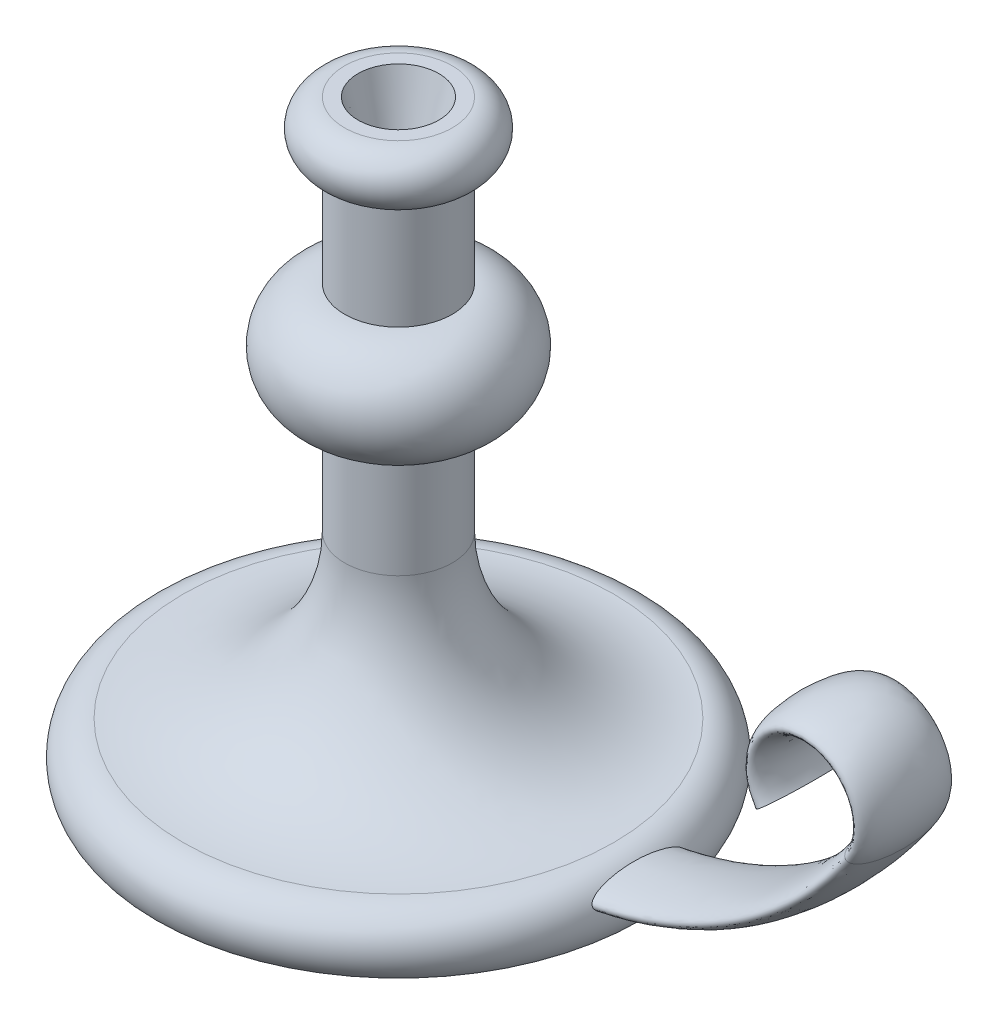
ISO-10303-21;
HEADER;
FILE_DESCRIPTION(('STEP AP214'),'2;1');
FILE_NAME('part.step','',(''),(''),'','','');
FILE_SCHEMA(('AUTOMOTIVE_DESIGN { 1 0 10303 214 1 1 1 1 }'));
ENDSEC;
DATA;
#1=APPLICATION_CONTEXT('core data for automotive mechanical design processes');
#2=APPLICATION_PROTOCOL_DEFINITION('international standard','automotive_design',2000,#1);
#3=PRODUCT_CONTEXT('',#1,'mechanical');
#4=PRODUCT('Part','Part','',(#3));
#5=PRODUCT_RELATED_PRODUCT_CATEGORY('part','',(#4));
#6=PRODUCT_DEFINITION_FORMATION('','',#4);
#7=PRODUCT_DEFINITION_CONTEXT('part definition',#1,'design');
#8=PRODUCT_DEFINITION('design','',#6,#7);
#9=PRODUCT_DEFINITION_SHAPE('','',#8);
#10=(LENGTH_UNIT() NAMED_UNIT(*) SI_UNIT(.MILLI.,.METRE.));
#11=(NAMED_UNIT(*) PLANE_ANGLE_UNIT() SI_UNIT($,.RADIAN.));
#12=(NAMED_UNIT(*) SI_UNIT($,.STERADIAN.) SOLID_ANGLE_UNIT());
#13=UNCERTAINTY_MEASURE_WITH_UNIT(LENGTH_MEASURE(1.E-05),#10,'distance_accuracy_value','');
#14=(GEOMETRIC_REPRESENTATION_CONTEXT(3) GLOBAL_UNCERTAINTY_ASSIGNED_CONTEXT((#13)) GLOBAL_UNIT_ASSIGNED_CONTEXT((#10,
#11,#12)) REPRESENTATION_CONTEXT('',''));
#15=CARTESIAN_POINT('',(0.,0.,0.));
#16=DIRECTION('',(0.,0.,1.));
#17=DIRECTION('',(1.,0.,0.));
#18=AXIS2_PLACEMENT_3D('',#15,#16,#17);
#19=CARTESIAN_POINT('',(0.,220.,0.));
#20=DIRECTION('',(0.,-1.,0.));
#21=DIRECTION('',(1.,0.,0.));
#22=AXIS2_PLACEMENT_3D('',#19,#20,#21);
#23=PLANE('',#22);
#24=CARTESIAN_POINT('',(0.,220.,0.));
#25=DIRECTION('',(0.,1.,0.));
#26=DIRECTION('',(-1.,0.,0.));
#27=AXIS2_PLACEMENT_3D('',#24,#25,#26);
#28=CIRCLE('',#27,15.);
#29=CARTESIAN_POINT('',(-15.,220.,0.));
#30=VERTEX_POINT('',#29);
#31=EDGE_CURVE('E73',#30,#30,#28,.T.);
#32=ORIENTED_EDGE('',*,*,#31,.F.);
#33=EDGE_LOOP('',(#32));
#34=FACE_BOUND('',#33,.T.);
#35=CARTESIAN_POINT('',(0.,220.,0.));
#36=DIRECTION('',(0.,1.,0.));
#37=DIRECTION('',(-1.,0.,0.));
#38=AXIS2_PLACEMENT_3D('',#35,#36,#37);
#39=CIRCLE('',#38,20.);
#40=CARTESIAN_POINT('',(-20.,220.,0.));
#41=VERTEX_POINT('',#40);
#42=EDGE_CURVE('E10',#41,#41,#39,.T.);
#43=ORIENTED_EDGE('',*,*,#42,.T.);
#44=EDGE_LOOP('',(#43));
#45=FACE_BOUND('',#44,.T.);
#46=ADVANCED_FACE('F37',(#34,#45),#23,.F.);
#47=CARTESIAN_POINT('',(0.,210.,0.));
#48=DIRECTION('',(0.,1.,0.));
#49=DIRECTION('',(-1.,0.,0.));
#50=AXIS2_PLACEMENT_3D('',#47,#48,#49);
#51=TOROIDAL_SURFACE('',#50,20.,10.);
#52=ORIENTED_EDGE('',*,*,#42,.F.);
#53=EDGE_LOOP('',(#52));
#54=FACE_BOUND('',#53,.T.);
#55=CARTESIAN_POINT('',(0.,200.,0.));
#56=DIRECTION('',(0.,1.,0.));
#57=DIRECTION('',(-1.,0.,0.));
#58=AXIS2_PLACEMENT_3D('',#55,#56,#57);
#59=CIRCLE('',#58,20.);
#60=CARTESIAN_POINT('',(-20.,200.,0.));
#61=VERTEX_POINT('',#60);
#62=EDGE_CURVE('E49',#61,#61,#59,.T.);
#63=ORIENTED_EDGE('',*,*,#62,.T.);
#64=EDGE_LOOP('',(#63));
#65=FACE_BOUND('',#64,.T.);
#66=ADVANCED_FACE('F111',(#54,#65),#51,.T.);
#67=CARTESIAN_POINT('',(0.,220.,0.));
#68=DIRECTION('',(0.,1.,0.));
#69=DIRECTION('',(-1.,0.,0.));
#70=AXIS2_PLACEMENT_3D('',#67,#68,#69);
#71=CYLINDRICAL_SURFACE('',#70,20.);
#72=ORIENTED_EDGE('',*,*,#62,.F.);
#73=EDGE_LOOP('',(#72));
#74=FACE_BOUND('',#73,.T.);
#75=CARTESIAN_POINT('',(0.,160.,0.));
#76=DIRECTION('',(0.,1.,0.));
#77=DIRECTION('',(-1.,0.,0.));
#78=AXIS2_PLACEMENT_3D('',#75,#76,#77);
#79=CIRCLE('',#78,20.);
#80=CARTESIAN_POINT('',(-20.,160.,0.));
#81=VERTEX_POINT('',#80);
#82=EDGE_CURVE('E53',#81,#81,#79,.T.);
#83=ORIENTED_EDGE('',*,*,#82,.T.);
#84=EDGE_LOOP('',(#83));
#85=FACE_BOUND('',#84,.T.);
#86=ADVANCED_FACE('F116',(#74,#85),#71,.T.);
#87=CARTESIAN_POINT('',(0.,140.,0.));
#88=DIRECTION('',(0.,1.,0.));
#89=DIRECTION('',(-1.,0.,0.));
#90=AXIS2_PLACEMENT_3D('',#87,#88,#89);
#91=DEGENERATE_TOROIDAL_SURFACE('',#90,20.,20.,.T.);
#92=ORIENTED_EDGE('',*,*,#82,.F.);
#93=EDGE_LOOP('',(#92));
#94=FACE_BOUND('',#93,.T.);
#95=CARTESIAN_POINT('',(0.,120.,0.));
#96=DIRECTION('',(0.,1.,0.));
#97=DIRECTION('',(-1.,0.,0.));
#98=AXIS2_PLACEMENT_3D('',#95,#96,#97);
#99=CIRCLE('',#98,20.);
#100=CARTESIAN_POINT('',(-20.,120.,0.));
#101=VERTEX_POINT('',#100);
#102=EDGE_CURVE('E58',#101,#101,#99,.T.);
#103=ORIENTED_EDGE('',*,*,#102,.T.);
#104=EDGE_LOOP('',(#103));
#105=FACE_BOUND('',#104,.T.);
#106=ADVANCED_FACE('F123',(#94,#105),#91,.T.);
#107=CARTESIAN_POINT('',(0.,220.,0.));
#108=DIRECTION('',(0.,1.,0.));
#109=DIRECTION('',(-1.,0.,0.));
#110=AXIS2_PLACEMENT_3D('',#107,#108,#109);
#111=CYLINDRICAL_SURFACE('',#110,20.);
#112=ORIENTED_EDGE('',*,*,#102,.F.);
#113=EDGE_LOOP('',(#112));
#114=FACE_BOUND('',#113,.T.);
#115=CARTESIAN_POINT('',(0.,79.9999999999999,0.));
#116=DIRECTION('',(0.,1.,0.));
#117=DIRECTION('',(-1.,0.,0.));
#118=AXIS2_PLACEMENT_3D('',#115,#116,#117);
#119=CIRCLE('',#118,20.);
#120=CARTESIAN_POINT('',(-20.,79.9999999999999,0.));
#121=VERTEX_POINT('',#120);
#122=EDGE_CURVE('E61',#121,#121,#119,.T.);
#123=ORIENTED_EDGE('',*,*,#122,.T.);
#124=EDGE_LOOP('',(#123));
#125=FACE_BOUND('',#124,.T.);
#126=ADVANCED_FACE('F130',(#114,#125),#111,.T.);
#127=CARTESIAN_POINT('',(0.,79.9999999999999,0.));
#128=DIRECTION('',(0.,1.,0.));
#129=DIRECTION('',(-1.,0.,0.));
#130=AXIS2_PLACEMENT_3D('',#127,#128,#129);
#131=TOROIDAL_SURFACE('',#130,80.,60.);
#132=ORIENTED_EDGE('',*,*,#122,.F.);
#133=EDGE_LOOP('',(#132));
#134=FACE_BOUND('',#133,.T.);
#135=CARTESIAN_POINT('',(0.,20.,0.));
#136=DIRECTION('',(0.,1.,0.));
#137=DIRECTION('',(-1.,0.,0.));
#138=AXIS2_PLACEMENT_3D('',#135,#136,#137);
#139=CIRCLE('',#138,80.);
#140=CARTESIAN_POINT('',(-80.,20.,0.));
#141=VERTEX_POINT('',#140);
#142=EDGE_CURVE('E64',#141,#141,#139,.T.);
#143=ORIENTED_EDGE('',*,*,#142,.T.);
#144=EDGE_LOOP('',(#143));
#145=FACE_BOUND('',#144,.T.);
#146=ADVANCED_FACE('F97',(#134,#145),#131,.F.);
#147=CARTESIAN_POINT('',(0.,7.49999999999998,0.));
#148=DIRECTION('',(0.,1.,0.));
#149=DIRECTION('',(-1.,0.,0.));
#150=AXIS2_PLACEMENT_3D('',#147,#148,#149);
#151=TOROIDAL_SURFACE('',#150,80.,12.5);
#152=CARTESIAN_POINT('',(89.5633381304029,12.934129869658,-17.5));
#153=CARTESIAN_POINT('',(89.5842946284706,12.8915231787123,-17.5000019733175));
#154=CARTESIAN_POINT('',(89.605350234187,12.8489765092313,-17.4977817911071));
#155=CARTESIAN_POINT('',(89.6474955691871,12.7643439063252,-17.4890029941796));
#156=CARTESIAN_POINT('',(89.6685853059591,12.7222580963931,-17.4824432442075));
#157=CARTESIAN_POINT('',(89.731695453947,12.5971133037732,-17.4565236188964));
#158=CARTESIAN_POINT('',(89.7735359024555,12.5152094476151,-17.4309236883279));
#159=CARTESIAN_POINT('',(89.867616705295,12.3333086596359,-17.3563602917853));
#160=CARTESIAN_POINT('',(89.9193351528946,12.2349933408969,-17.3027627239593));
#161=CARTESIAN_POINT('',(90.0193866532414,12.0476028443924,-17.1788431955794));
#162=CARTESIAN_POINT('',(90.0677108841761,11.9585514751454,-17.1084796006091));
#163=CARTESIAN_POINT('',(90.1552882037961,11.7993713928116,-16.9652678411335));
#164=CARTESIAN_POINT('',(90.1949342689887,11.7282540023688,-16.8937286920524));
#165=CARTESIAN_POINT('',(90.2717880108913,11.5919517816763,-16.7439370238723));
#166=CARTESIAN_POINT('',(90.3089935906403,11.5267720350648,-16.6656788614429));
#167=CARTESIAN_POINT('',(90.3812508916045,11.4015226944006,-16.5040289711719));
#168=CARTESIAN_POINT('',(90.4162986266254,11.3414624834121,-16.4206282804308));
#169=CARTESIAN_POINT('',(90.484406007487,11.2259040031702,-16.2500114570353));
#170=CARTESIAN_POINT('',(90.5174662249048,11.1704044206549,-16.1627964339045));
#171=CARTESIAN_POINT('',(90.5863212099886,11.0558861380754,-15.9729723376026));
#172=CARTESIAN_POINT('',(90.6218534496513,10.9974577325792,-15.8699138993928));
#173=CARTESIAN_POINT('',(90.6909067791187,10.8850198462038,-15.6607611970006));
#174=CARTESIAN_POINT('',(90.7244276360259,10.8310108767881,-15.5546665833525));
#175=CARTESIAN_POINT('',(90.7896239803678,10.726928033257,-15.3402415709073));
#176=CARTESIAN_POINT('',(90.8213023021529,10.6768480714377,-15.2319149729762));
#177=CARTESIAN_POINT('',(90.8830482391106,10.5800712893992,-15.0133260825547));
#178=CARTESIAN_POINT('',(90.9131159511556,10.5333742656491,-14.9030639070131));
#179=CARTESIAN_POINT('',(90.9818405984944,10.4274990694272,-14.6429011154134));
#180=CARTESIAN_POINT('',(91.0199127548173,10.3695230747514,-14.4923571539019));
#181=CARTESIAN_POINT('',(91.0937207080298,10.2582358065681,-14.188978682674));
#182=CARTESIAN_POINT('',(91.1294561746706,10.2049251920691,-14.0361438529208));
#183=CARTESIAN_POINT('',(91.1988513013282,10.1023451312287,-13.7284640028442));
#184=CARTESIAN_POINT('',(91.232508594203,10.053080272874,-13.5736169248258));
#185=CARTESIAN_POINT('',(91.2978857974932,9.95819857119236,-13.2623996911057));
#186=CARTESIAN_POINT('',(91.3296055831709,9.91258196268304,-13.1060294380912));
#187=CARTESIAN_POINT('',(91.4221162896024,9.78058413247763,-12.6348683891826));
#188=CARTESIAN_POINT('',(91.4802265303824,9.69910193905613,-12.3181711326914));
#189=CARTESIAN_POINT('',(91.5904631008941,9.5465535177188,-11.6795207575222));
#190=CARTESIAN_POINT('',(91.642557039,9.47554314999862,-11.3575489606922));
#191=CARTESIAN_POINT('',(91.7410013263322,9.34289166948932,-10.7110840141271));
#192=CARTESIAN_POINT('',(91.7873560290566,9.28124344689962,-10.3865929764067));
#193=CARTESIAN_POINT('',(91.874814015815,9.16608890247631,-9.73553215244951));
#194=CARTESIAN_POINT('',(91.9159181222114,9.11258130538483,-9.40896270017176));
#195=CARTESIAN_POINT('',(91.9940953951584,9.01168909049811,-8.74673259839616));
#196=CARTESIAN_POINT('',(92.0310562111443,8.96447055431779,-8.41103353442978));
#197=CARTESIAN_POINT('',(92.1001198298674,8.87690184929062,-7.73823655203939));
#198=CARTESIAN_POINT('',(92.1322224531944,8.83655193409083,-7.40113858242675));
#199=CARTESIAN_POINT('',(92.1917832262867,8.76216291875641,-6.72574998911348));
#200=CARTESIAN_POINT('',(92.2192401510172,8.72812548294693,-6.38745907477459));
#201=CARTESIAN_POINT('',(92.2696568184355,8.6659539173528,-5.70999717918959));
#202=CARTESIAN_POINT('',(92.2926164120472,8.63781998325331,-5.37082616914782));
#203=CARTESIAN_POINT('',(92.354833555869,8.5618917071916,-4.35399027629778));
#204=CARTESIAN_POINT('',(92.3875793356779,8.52238567228697,-3.67528504652745));
#205=CARTESIAN_POINT('',(92.4363012448863,8.4638081652651,-2.31641355543291));
#206=CARTESIAN_POINT('',(92.4522769722328,8.44473718306726,-1.63624725947213));
#207=CARTESIAN_POINT('',(92.4667889250181,8.42741458595519,-0.358184413517908));
#208=CARTESIAN_POINT('',(92.4672090709006,8.42691392345656,0.239661865199325));
#209=CARTESIAN_POINT('',(92.455319385587,8.4411046474986,1.4351392942081));
#210=CARTESIAN_POINT('',(92.4430076878591,8.45579826157227,2.03277040010371));
#211=CARTESIAN_POINT('',(92.4054829631688,8.50083277815007,3.22723629521049));
#212=CARTESIAN_POINT('',(92.3802658566019,8.53117862859836,3.82407077274299));
#213=CARTESIAN_POINT('',(92.3165286819661,8.6085457575508,5.01673895088834));
#214=CARTESIAN_POINT('',(92.2779913075204,8.65558873196406,5.6125703311972));
#215=CARTESIAN_POINT('',(92.1870221249838,8.76797025430271,6.8013396225942));
#216=CARTESIAN_POINT('',(92.1345939232124,8.83330405383563,7.39427824406478));
#217=CARTESIAN_POINT('',(92.0447981977603,8.94700226920682,8.28036057100812));
#218=CARTESIAN_POINT('',(92.0130163539259,8.98750631938004,8.57509671225969));
#219=CARTESIAN_POINT('',(91.9455503104999,9.07422967304391,9.16327420677785));
#220=CARTESIAN_POINT('',(91.9098662808527,9.12044872765155,9.4567156158528));
#221=CARTESIAN_POINT('',(91.8343586914181,9.21920437918974,10.0421092081673));
#222=CARTESIAN_POINT('',(91.794533716168,9.27174313729715,10.3340608461608));
#223=CARTESIAN_POINT('',(91.7104557226856,9.38389336275882,10.9160095810171));
#224=CARTESIAN_POINT('',(91.6662021478421,9.44350571933768,11.2060064272895));
#225=CARTESIAN_POINT('',(91.5728541305627,9.57083415736847,11.7836497722661));
#226=CARTESIAN_POINT('',(91.5237565659481,9.63855547151114,12.0712946239633));
#227=CARTESIAN_POINT('',(91.4202805483767,9.78332792926111,12.6429185657796));
#228=CARTESIAN_POINT('',(91.365908288909,9.86036815633934,12.9269015220124));
#229=CARTESIAN_POINT('',(91.2511347278219,10.0256453821652,13.4902688505866));
#230=CARTESIAN_POINT('',(91.1907363825053,10.1138768963513,13.7696554002478));
#231=CARTESIAN_POINT('',(91.0948443937959,10.2566043739776,14.1837684431819));
#232=CARTESIAN_POINT('',(91.0620144095979,10.3058850185138,14.3209159750819));
#233=CARTESIAN_POINT('',(90.9943982535883,10.4083821489724,14.593238211898));
#234=CARTESIAN_POINT('',(90.9596122585281,10.4615982794084,14.7284130936832));
#235=CARTESIAN_POINT('',(90.8831968090424,10.5797397555994,15.0137552436675));
#236=CARTESIAN_POINT('',(90.8412656843246,10.6452878538235,15.1635861869042));
#237=CARTESIAN_POINT('',(90.75419591102,10.7831960049013,15.4592417572464));
#238=CARTESIAN_POINT('',(90.7090559080988,10.8555589382494,15.6050646562847));
#239=CARTESIAN_POINT('',(90.6152612169264,11.0081115009575,15.8905210060947));
#240=CARTESIAN_POINT('',(90.5666233403185,11.0882642686816,16.0301794577237));
#241=CARTESIAN_POINT('',(90.4650055555343,11.25842084121,16.301617853879));
#242=CARTESIAN_POINT('',(90.412030376334,11.348413952061,16.4334061150732));
#243=CARTESIAN_POINT('',(90.3141032140374,11.5177694982256,16.6553022908176));
#244=CARTESIAN_POINT('',(90.2702551130263,11.5945407234368,16.7478495561919));
#245=CARTESIAN_POINT('',(90.1790131806222,11.756647852833,16.9236373366371));
#246=CARTESIAN_POINT('',(90.1316137634438,11.8419973247209,17.0068626538502));
#247=CARTESIAN_POINT('',(90.0323020878064,12.0237088103468,17.1606915073449));
#248=CARTESIAN_POINT('',(89.9803396745888,12.1201982192657,17.2311191496349));
#249=CARTESIAN_POINT('',(89.8997369769945,12.2724951767108,17.3212500740828));
#250=CARTESIAN_POINT('',(89.8724569689197,12.324461414712,17.3486874399249));
#251=CARTESIAN_POINT('',(89.8171348783103,12.4307634692287,17.3974872843325));
#252=CARTESIAN_POINT('',(89.7890932685569,12.4850978278026,17.418853441389));
#253=CARTESIAN_POINT('',(89.7220176324404,12.616214843554,17.4611526637327));
#254=CARTESIAN_POINT('',(89.6827370270821,12.6938982555524,17.4790309793806));
#255=CARTESIAN_POINT('',(89.6041424913278,12.8511938834082,17.4997245999063));
#256=CARTESIAN_POINT('',(89.5648286136189,12.9308044876281,17.5025520819341));
#257=CARTESIAN_POINT('',(89.4872863233728,13.0895933107061,17.4927509651244));
#258=CARTESIAN_POINT('',(89.4490579631515,13.1687715085767,17.4801216226437));
#259=CARTESIAN_POINT('',(89.3746210665389,13.324500929058,17.4406847367785));
#260=CARTESIAN_POINT('',(89.3384146686993,13.4010493385135,17.4138624847321));
#261=CARTESIAN_POINT('',(89.2551598396039,13.5786087511144,17.3357761112854));
#262=CARTESIAN_POINT('',(89.2092733787417,13.6777532619644,17.2790845030441));
#263=CARTESIAN_POINT('',(89.1223919719091,13.8672332319302,17.149281267696));
#264=CARTESIAN_POINT('',(89.0814168795643,13.9575326839384,17.0761062250405));
#265=CARTESIAN_POINT('',(89.0082181949378,14.1199926792181,16.9272301632672));
#266=CARTESIAN_POINT('',(88.9755281245377,14.1930536034877,16.8527155811955));
#267=CARTESIAN_POINT('',(88.9131849772436,14.3330599412323,16.6972696301232));
#268=CARTESIAN_POINT('',(88.8835272841925,14.4000146328542,16.6163483575325));
#269=CARTESIAN_POINT('',(88.8266313858395,14.5289079753879,16.4493822343543));
#270=CARTESIAN_POINT('',(88.7994015622443,14.5908291889014,16.3633212266908));
#271=CARTESIAN_POINT('',(88.7470690119042,14.7101112606053,16.1874540545734));
#272=CARTESIAN_POINT('',(88.7219670120887,14.7674705598973,16.0976466257379));
#273=CARTESIAN_POINT('',(88.6734182342556,14.8785526813977,15.9145355918254));
#274=CARTESIAN_POINT('',(88.6499834890289,14.9322489713679,15.8212128066909));
#275=CARTESIAN_POINT('',(88.6046878297925,15.0360812740072,15.632225862282));
#276=CARTESIAN_POINT('',(88.5828271917444,15.0862166623825,15.5365612963826));
#277=CARTESIAN_POINT('',(88.5192221917302,15.2320338936647,15.2465015829042));
#278=CARTESIAN_POINT('',(88.4795156521216,15.3229869748787,15.0492770914167));
#279=CARTESIAN_POINT('',(88.4042534522554,15.494823000559,14.649612658471));
#280=CARTESIAN_POINT('',(88.3687011394923,15.5756978273636,14.4471686692734));
#281=CARTESIAN_POINT('',(88.3007854430093,15.7293946042716,14.0376786774037));
#282=CARTESIAN_POINT('',(88.2684370982842,15.8021787565915,13.8306160898356));
#283=CARTESIAN_POINT('',(88.2065476175517,15.9404973068026,13.4139379974936));
#284=CARTESIAN_POINT('',(88.1770035435391,16.0060393043124,13.2043254300588));
#285=CARTESIAN_POINT('',(88.1202688054795,16.1309158619243,12.7830117215364));
#286=CARTESIAN_POINT('',(88.0930775738,16.1902519199585,12.5713110980071));
#287=CARTESIAN_POINT('',(88.034179663782,16.3176611878182,12.0930046544936));
#288=CARTESIAN_POINT('',(88.0030466711926,16.3842030470065,11.8259211984387));
#289=CARTESIAN_POINT('',(87.9435402356177,16.5099120760994,11.2897061815167));
#290=CARTESIAN_POINT('',(87.9151670627436,16.5690785243113,11.0205744229505));
#291=CARTESIAN_POINT('',(87.8608855269656,16.680905902654,10.4805857130193));
#292=CARTESIAN_POINT('',(87.8349783475196,16.7335637128001,10.209727999214));
#293=CARTESIAN_POINT('',(87.7854524785039,16.8330010609975,9.66672296854017));
#294=CARTESIAN_POINT('',(87.7618338952952,16.8797803258779,9.3945755923516));
#295=CARTESIAN_POINT('',(87.6943455208303,17.0118475618646,8.57822239334391));
#296=CARTESIAN_POINT('',(87.6536793673776,17.0891990413778,8.03245496649146));
#297=CARTESIAN_POINT('',(87.5804149579209,17.2257181333877,6.93828851315555));
#298=CARTESIAN_POINT('',(87.5478149201928,17.2848897623304,6.38989009516299));
#299=CARTESIAN_POINT('',(87.4906507576091,17.3869188321525,5.29265707783934));
#300=CARTESIAN_POINT('',(87.4660653255462,17.4298195804551,4.74382758848445));
#301=CARTESIAN_POINT('',(87.4248785133954,17.5008390416656,3.6448951539645));
#302=CARTESIAN_POINT('',(87.4082775636172,17.5289569578867,3.0947921417702));
#303=CARTESIAN_POINT('',(87.3831682533082,17.5712192487034,1.99357844967067));
#304=CARTESIAN_POINT('',(87.3746641674799,17.5853562422869,1.44246739122488));
#305=CARTESIAN_POINT('',(87.3658412567979,17.600019735049,0.340013438976391));
#306=CARTESIAN_POINT('',(87.3655222364473,17.6005465593007,-0.211329448974618));
#307=CARTESIAN_POINT('',(87.3730716131594,17.588005622228,-1.31372186923202));
#308=CARTESIAN_POINT('',(87.3809387685269,17.5749399226445,-1.86477143334741));
#309=CARTESIAN_POINT('',(87.4047862410929,17.5348582520926,-2.96621092917294));
#310=CARTESIAN_POINT('',(87.4207668258382,17.5078418210877,-3.51660083853048));
#311=CARTESIAN_POINT('',(87.4607243806583,17.4390976347868,-4.61603565001861));
#312=CARTESIAN_POINT('',(87.4846993372176,17.3973735836988,-5.16508085579378));
#313=CARTESIAN_POINT('',(87.5405649400252,17.2979621535139,-6.26130339788126));
#314=CARTESIAN_POINT('',(87.5724549022029,17.2402761539117,-6.80848089147354));
#315=CARTESIAN_POINT('',(87.6277670184264,17.1375860080254,-7.64957744752029));
#316=CARTESIAN_POINT('',(87.6483575912149,17.0989136468663,-7.94446586620012));
#317=CARTESIAN_POINT('',(87.6919404119246,17.0158997032225,-8.53326344216748));
#318=CARTESIAN_POINT('',(87.7149325899273,16.9715582857738,-8.82717262770673));
#319=CARTESIAN_POINT('',(87.7634060476596,16.8767064547918,-9.4136673299471));
#320=CARTESIAN_POINT('',(87.7888863107236,16.8261985588717,-9.70625333660597));
#321=CARTESIAN_POINT('',(87.8425032866575,16.7183423907029,-10.2899180454621));
#322=CARTESIAN_POINT('',(87.8706399122388,16.6609943432065,-10.5809967968567));
#323=CARTESIAN_POINT('',(87.9209926610891,16.556866621203,-11.0746623914616));
#324=CARTESIAN_POINT('',(87.942470145581,16.5120396730156,-11.2777371404123));
#325=CARTESIAN_POINT('',(87.9869830963184,16.4182278991963,-11.6827504075146));
#326=CARTESIAN_POINT('',(88.0100185153632,16.3692431995202,-11.8846889598888));
#327=CARTESIAN_POINT('',(88.0578337933719,16.2666209214921,-12.2873630503995));
#328=CARTESIAN_POINT('',(88.0826151236668,16.2129794096496,-12.4880974153557));
#329=CARTESIAN_POINT('',(88.1341273668285,16.1005178325075,-12.887858419726));
#330=CARTESIAN_POINT('',(88.1608582151843,16.0416979385511,-13.0868851154047));
#331=CARTESIAN_POINT('',(88.2165671586539,15.9181748732155,-13.482761684066));
#332=CARTESIAN_POINT('',(88.2455448939432,15.8534726435693,-13.6796118998522));
#333=CARTESIAN_POINT('',(88.3061602480773,15.717261014401,-14.0705264068157));
#334=CARTESIAN_POINT('',(88.3377976068718,15.6457522803087,-14.2645909681986));
#335=CARTESIAN_POINT('',(88.4042740210015,15.4947770162067,-14.6488346570465));
#336=CARTESIAN_POINT('',(88.4391098655062,15.4153184596673,-14.8390174517651));
#337=CARTESIAN_POINT('',(88.5128058122123,15.2467599725185,-15.2142457477171));
#338=CARTESIAN_POINT('',(88.5516640857925,15.157664422126,-15.3992935352612));
#339=CARTESIAN_POINT('',(88.6138942327098,15.0149784700796,-15.6713750547926));
#340=CARTESIAN_POINT('',(88.6353106934407,14.9658727961976,-15.7612132655984));
#341=CARTESIAN_POINT('',(88.6796600876737,14.8642690210832,-15.9385599130379));
#342=CARTESIAN_POINT('',(88.7025927585636,14.8117715073635,-16.0260687494627));
#343=CARTESIAN_POINT('',(88.750237434087,14.7028929564909,-16.1982342956797));
#344=CARTESIAN_POINT('',(88.7749505650293,14.6465094620844,-16.2828891494696));
#345=CARTESIAN_POINT('',(88.826441220484,14.5293610941554,-16.4484550923682));
#346=CARTESIAN_POINT('',(88.8532182322923,14.4685973090151,-16.529367103324));
#347=CARTESIAN_POINT('',(88.9020211724354,14.3582969590308,-16.6661625838652));
#348=CARTESIAN_POINT('',(88.9235018693124,14.3098832028354,-16.7231385195299));
#349=CARTESIAN_POINT('',(88.9679767611158,14.2100201741889,-16.8337327785707));
#350=CARTESIAN_POINT('',(88.9909713263711,14.1585701593165,-16.8873502740841));
#351=CARTESIAN_POINT('',(89.0624280840053,13.9994092800679,-17.0417861671941));
#352=CARTESIAN_POINT('',(89.1134880485681,13.8866041218553,-17.1365533129908));
#353=CARTESIAN_POINT('',(89.2036867075544,13.6899694221347,-17.2703493392457));
#354=CARTESIAN_POINT('',(89.2404771882773,13.6103755295131,-17.317150800664));
#355=CARTESIAN_POINT('',(89.3172943884807,13.445861573897,-17.3965460134464));
#356=CARTESIAN_POINT('',(89.3573132482437,13.3609545528755,-17.4291731052386));
#357=CARTESIAN_POINT('',(89.4252104739082,13.2185613546428,-17.4684634100755));
#358=CARTESIAN_POINT('',(89.4523270049884,13.1620984167212,-17.4802367248933));
#359=CARTESIAN_POINT('',(89.50734902146,13.0484310619029,-17.4960040864878));
#360=CARTESIAN_POINT('',(89.5352545854393,12.9912265714569,-17.4999973555815));
#361=CARTESIAN_POINT('',(89.5633381304029,12.934129869658,-17.5));
#362=B_SPLINE_CURVE_WITH_KNOTS('',3,(#152,#153,#154,#155,#156,#157,#158,#159,#160,#161,#162,
#163,#164,#165,#166,#167,#168,#169,#170,#171,#172,#173,#174,#175,#176,#177,#178,#179,#180,#181,
#182,#183,#184,#185,#186,#187,#188,#189,#190,#191,#192,#193,#194,#195,#196,#197,#198,#199,#200,
#201,#202,#203,#204,#205,#206,#207,#208,#209,#210,#211,#212,#213,#214,#215,#216,#217,#218,#219,
#220,#221,#222,#223,#224,#225,#226,#227,#228,#229,#230,#231,#232,#233,#234,#235,#236,#237,#238,
#239,#240,#241,#242,#243,#244,#245,#246,#247,#248,#249,#250,#251,#252,#253,#254,#255,#256,#257,
#258,#259,#260,#261,#262,#263,#264,#265,#266,#267,#268,#269,#270,#271,#272,#273,#274,#275,#276,
#277,#278,#279,#280,#281,#282,#283,#284,#285,#286,#287,#288,#289,#290,#291,#292,#293,#294,#295,
#296,#297,#298,#299,#300,#301,#302,#303,#304,#305,#306,#307,#308,#309,#310,#311,#312,#313,#314,
#315,#316,#317,#318,#319,#320,#321,#322,#323,#324,#325,#326,#327,#328,#329,#330,#331,#332,#333,
#334,#335,#336,#337,#338,#339,#340,#341,#342,#343,#344,#345,#346,#347,#348,#349,#350,#351,#352,
#353,#354,#355,#356,#357,#358,#359,#360,#361),.UNSPECIFIED.,.T.,.F.,(4,2,2,2,2,2,2,2,2,2,2,2,2,
2,2,2,2,2,2,2,2,2,2,2,2,2,2,2,2,2,2,2,2,2,2,2,2,2,2,2,2,2,2,2,2,2,2,2,2,2,2,2,2,2,2,2,2,2,2,2,2,
2,2,2,2,2,2,2,2,2,2,2,2,2,2,2,2,2,2,2,2,2,2,2,2,2,2,2,2,2,2,2,2,2,2,2,2,2,2,2,2,2,2,2,4),(0.,
0.142373089609724,0.284783439545544,0.569744078160416,0.937734118298166,1.30664767614136,
1.63133673593869,1.95630122252569,2.28184904040841,2.60730278380412,2.97818928915432,
3.34911865684743,3.71946145543197,4.08978195418707,4.58692048681186,5.0841291298118,
5.58189404962233,6.07969098204825,7.07574836618247,8.07694047777564,9.07736842041902,
10.077639480744,11.1005603058205,12.1235188975175,13.1467468164744,14.170008647321,
16.2113347216219,18.2527097345234,20.0459283855029,21.8394099657566,23.6334588445185,
25.4298474604529,27.2257701564007,28.1233006162937,29.020792003348,29.9185911867528,
30.8165033526236,31.7149980936798,32.6124503155492,33.5094644063563,33.9575567064372,
34.4056085803507,34.9119267498817,35.4184598988016,35.9227031257054,36.4264037145313,
36.8098530154186,37.1939186355722,37.5829185032697,37.7770017631897,37.9709671778261,
38.2363344458186,38.5014869809388,38.7666522733123,39.0320929065046,39.3992505322326,
39.7678455823631,40.0954390061661,40.4225260711356,40.7507018287301,41.078989253045,
41.4094458337434,41.7399602074851,42.4018314950337,43.0642324961622,43.7296084264608,
44.3942793715645,45.0587895125138,45.8896534897324,46.7205987042766,47.5519407090469,
48.3833213312969,50.0410110960949,51.6983343663034,53.3512149333626,55.0041845695104,
56.6580264003519,58.3118287298623,59.9653802439457,61.6189862887156,63.272176159462,
64.9252231996001,65.8195457950142,66.7138423610613,67.6077750223695,68.5016783191016,
69.1288442026032,69.7559910934134,70.3836729716213,71.0113340887748,71.6388948968283,
72.2663944150455,72.8932707590241,73.5198633623728,73.833587917127,74.1472582754692,
74.4611288322895,74.7749216679147,75.0081511061512,75.2414378115152,75.7065837385554,
76.0038566262345,76.3004264430234,76.4911997984888,76.6819922224299),.UNSPECIFIED.);
#363=CARTESIAN_POINT('',(89.5633381304029,12.934129869658,-17.5));
#364=VERTEX_POINT('',#363);
#365=EDGE_CURVE('E40',#364,#364,#362,.T.);
#366=ORIENTED_EDGE('',*,*,#365,.T.);
#367=EDGE_LOOP('',(#366));
#368=FACE_BOUND('',#367,.T.);
#369=ORIENTED_EDGE('',*,*,#142,.F.);
#370=EDGE_LOOP('',(#369));
#371=FACE_BOUND('',#370,.T.);
#372=CARTESIAN_POINT('',(0.,0.,0.));
#373=DIRECTION('',(0.,1.,0.));
#374=DIRECTION('',(-1.,0.,0.));
#375=AXIS2_PLACEMENT_3D('',#372,#373,#374);
#376=CIRCLE('',#375,90.);
#377=CARTESIAN_POINT('',(-90.,0.,0.));
#378=VERTEX_POINT('',#377);
#379=EDGE_CURVE('E67',#378,#378,#376,.T.);
#380=ORIENTED_EDGE('',*,*,#379,.T.);
#381=EDGE_LOOP('',(#380));
#382=FACE_BOUND('',#381,.T.);
#383=ADVANCED_FACE('F93',(#368,#371,#382),#151,.T.);
#384=CARTESIAN_POINT('',(0.,0.,0.));
#385=DIRECTION('',(0.,1.,0.));
#386=DIRECTION('',(-1.,0.,0.));
#387=AXIS2_PLACEMENT_3D('',#384,#385,#386);
#388=PLANE('',#387);
#389=ORIENTED_EDGE('',*,*,#379,.F.);
#390=EDGE_LOOP('',(#389));
#391=FACE_BOUND('',#390,.T.);
#392=ADVANCED_FACE('F96',(#391),#388,.F.);
#393=CARTESIAN_POINT('',(0.,220.,0.));
#394=DIRECTION('',(0.,1.,0.));
#395=DIRECTION('',(-1.,0.,0.));
#396=AXIS2_PLACEMENT_3D('',#393,#394,#395);
#397=CONICAL_SURFACE('',#396,15.,0.26179938779915);
#398=CARTESIAN_POINT('',(0.,195.,0.));
#399=DIRECTION('',(0.,1.,0.));
#400=DIRECTION('',(-1.,0.,0.));
#401=AXIS2_PLACEMENT_3D('',#398,#399,#400);
#402=CIRCLE('',#401,8.30127018922192);
#403=CARTESIAN_POINT('',(-8.30127018922193,195.,0.));
#404=VERTEX_POINT('',#403);
#405=EDGE_CURVE('E70',#404,#404,#402,.T.);
#406=ORIENTED_EDGE('',*,*,#405,.F.);
#407=EDGE_LOOP('',(#406));
#408=FACE_BOUND('',#407,.T.);
#409=ORIENTED_EDGE('',*,*,#31,.T.);
#410=EDGE_LOOP('',(#409));
#411=FACE_BOUND('',#410,.T.);
#412=ADVANCED_FACE('F103',(#408,#411),#397,.F.);
#413=CARTESIAN_POINT('',(0.,195.,0.));
#414=DIRECTION('',(0.,1.,0.));
#415=DIRECTION('',(-1.,0.,0.));
#416=AXIS2_PLACEMENT_3D('',#413,#414,#415);
#417=PLANE('',#416);
#418=ORIENTED_EDGE('',*,*,#405,.T.);
#419=EDGE_LOOP('',(#418));
#420=FACE_BOUND('',#419,.T.);
#421=ADVANCED_FACE('F89',(#420),#417,.T.);
#422=CARTESIAN_POINT('',(60.,10.,-17.5));
#423=CARTESIAN_POINT('',(110.465826555603,10.,-17.5));
#424=CARTESIAN_POINT('',(155.147693614908,33.4591220218224,-17.5));
#425=CARTESIAN_POINT('',(183.803497682187,75.,-17.5));
#426=CARTESIAN_POINT('',(60.,20.,-17.5));
#427=CARTESIAN_POINT('',(107.110438480476,20.,-17.5));
#428=CARTESIAN_POINT('',(148.821483220246,41.8993643866583,-17.5));
#429=CARTESIAN_POINT('',(175.572010988432,80.6782591355572,-17.5));
#430=CARTESIAN_POINT('',(60.,20.,17.5));
#431=CARTESIAN_POINT('',(107.110438480476,20.,17.5));
#432=CARTESIAN_POINT('',(148.821483220246,41.8993643866583,17.5));
#433=CARTESIAN_POINT('',(175.572010988432,80.6782591355572,17.5));
#434=CARTESIAN_POINT('',(60.,10.,17.5));
#435=CARTESIAN_POINT('',(110.465826555603,10.,17.5));
#436=CARTESIAN_POINT('',(155.147693614908,33.4591220218224,17.5));
#437=CARTESIAN_POINT('',(183.803497682187,75.,17.5));
#438=CARTESIAN_POINT('',(60.,0.,17.5));
#439=CARTESIAN_POINT('',(113.821214630729,0.,17.5));
#440=CARTESIAN_POINT('',(161.47390400957,25.0188796569863,17.5));
#441=CARTESIAN_POINT('',(192.034984375942,69.3217408644428,17.5));
#442=CARTESIAN_POINT('',(60.,0.,-17.5));
#443=CARTESIAN_POINT('',(113.821214630729,0.,-17.5));
#444=CARTESIAN_POINT('',(161.47390400957,25.0188796569863,-17.5));
#445=CARTESIAN_POINT('',(192.034984375942,69.3217408644428,-17.5));
#446=CARTESIAN_POINT('',(60.,10.,-17.5));
#447=CARTESIAN_POINT('',(110.465826555603,10.,-17.5));
#448=CARTESIAN_POINT('',(155.147693614908,33.4591220218224,-17.5));
#449=CARTESIAN_POINT('',(183.803497682187,75.,-17.5));
#450=(BOUNDED_SURFACE() B_SPLINE_SURFACE(3,3,((#422,#423,#424,#425),(#426,#427,#428,#429),(#430,
#431,#432,#433),(#434,#435,#436,#437),(#438,#439,#440,#441),(#442,#443,#444,#445),(#446,#447,
#448,#449)),.UNSPECIFIED.,.T.,.F.,.F.) B_SPLINE_SURFACE_WITH_KNOTS((4,3,4),(4,4),(0.,0.5,1.),
(0.,1.),.UNSPECIFIED.) GEOMETRIC_REPRESENTATION_ITEM() RATIONAL_B_SPLINE_SURFACE(((1.,
0.923592393888898,0.923592393888898,1.),(0.333333333333333,0.307864131296299,0.307864131296299,
0.333333333333333),(0.333333333333333,0.307864131296299,0.307864131296299,0.333333333333333),
(1.,0.923592393888898,0.923592393888898,1.),(0.333333333333333,0.307864131296299,
0.307864131296299,0.333333333333333),(0.333333333333333,0.307864131296299,0.307864131296299,
0.333333333333333),(1.,0.923592393888898,0.923592393888898,1.))) REPRESENTATION_ITEM('') SURFACE());
#451=CARTESIAN_POINT('',(183.803497682187,75.,0.));
#452=DIRECTION('',(0.567825913555721,0.823148669375473,0.));
#453=DIRECTION('',(0.,0.,-1.));
#454=AXIS2_PLACEMENT_3D('',#451,#452,#453);
#455=ELLIPSE('',#454,17.5,5.);
#456=CARTESIAN_POINT('',(183.803497682187,75.,-17.5));
#457=VERTEX_POINT('',#456);
#458=EDGE_CURVE('E79',#457,#457,#455,.T.);
#459=ORIENTED_EDGE('',*,*,#458,.F.);
#460=EDGE_LOOP('',(#459));
#461=FACE_BOUND('',#460,.T.);
#462=ORIENTED_EDGE('',*,*,#365,.F.);
#463=EDGE_LOOP('',(#462));
#464=FACE_BOUND('',#463,.T.);
#465=ADVANCED_FACE('F85',(#461,#464),#450,.T.);
#466=CARTESIAN_POINT('',(150.877550907168,75.,0.));
#467=DIRECTION('',(0.567825913555719,-0.823148669375474,0.));
#468=DIRECTION('',(0.,0.,-1.));
#469=AXIS2_PLACEMENT_3D('',#466,#467,#468);
#470=PLANE('',#469);
#471=CARTESIAN_POINT('',(150.877550907168,75.,0.));
#472=DIRECTION('',(0.567825913555719,-0.823148669375474,0.));
#473=DIRECTION('',(0.,0.,-1.));
#474=AXIS2_PLACEMENT_3D('',#471,#472,#473);
#475=ELLIPSE('',#474,17.5,5.);
#476=CARTESIAN_POINT('',(150.877550907168,75.,-17.5));
#477=VERTEX_POINT('',#476);
#478=EDGE_CURVE('E76',#477,#477,#475,.T.);
#479=ORIENTED_EDGE('',*,*,#478,.T.);
#480=EDGE_LOOP('',(#479));
#481=FACE_BOUND('',#480,.T.);
#482=ADVANCED_FACE('F88',(#481),#470,.T.);
#483=CARTESIAN_POINT('',(183.803497682187,75.,-17.5));
#484=CARTESIAN_POINT('',(194.224718247811,90.1071193425192,-17.5));
#485=CARTESIAN_POINT('',(185.69336856761,106.356518271114,-17.5));
#486=CARTESIAN_POINT('',(167.340524294678,106.356518271114,-17.5));
#487=CARTESIAN_POINT('',(148.987680021746,106.356518271114,-17.5));
#488=CARTESIAN_POINT('',(140.456330341545,90.1071193425193,-17.5));
#489=CARTESIAN_POINT('',(150.877550907168,75.,-17.5));
#490=CARTESIAN_POINT('',(175.572010988433,80.6782591355572,-17.5));
#491=CARTESIAN_POINT('',(180.782621271244,88.2318188068168,-17.5));
#492=CARTESIAN_POINT('',(176.516946431144,96.3565182711145,-17.5));
#493=CARTESIAN_POINT('',(167.340524294678,96.3565182711144,-17.5));
#494=CARTESIAN_POINT('',(158.164102158212,96.3565182711144,-17.5));
#495=CARTESIAN_POINT('',(153.898427318111,88.2318188068168,-17.5));
#496=CARTESIAN_POINT('',(159.109037600923,80.6782591355572,-17.5));
#497=CARTESIAN_POINT('',(175.572010988433,80.6782591355572,17.5));
#498=CARTESIAN_POINT('',(180.782621271244,88.2318188068168,17.5));
#499=CARTESIAN_POINT('',(176.516946431144,96.3565182711145,17.5));
#500=CARTESIAN_POINT('',(167.340524294678,96.3565182711144,17.5));
#501=CARTESIAN_POINT('',(158.164102158212,96.3565182711144,17.5));
#502=CARTESIAN_POINT('',(153.898427318111,88.2318188068168,17.5));
#503=CARTESIAN_POINT('',(159.109037600923,80.6782591355572,17.5));
#504=CARTESIAN_POINT('',(183.803497682187,75.,17.5));
#505=CARTESIAN_POINT('',(194.224718247811,90.1071193425192,17.5));
#506=CARTESIAN_POINT('',(185.69336856761,106.356518271114,17.5));
#507=CARTESIAN_POINT('',(167.340524294678,106.356518271114,17.5));
#508=CARTESIAN_POINT('',(148.987680021746,106.356518271114,17.5));
#509=CARTESIAN_POINT('',(140.456330341545,90.1071193425193,17.5));
#510=CARTESIAN_POINT('',(150.877550907168,75.,17.5));
#511=CARTESIAN_POINT('',(192.034984375942,69.3217408644428,17.5));
#512=CARTESIAN_POINT('',(207.666815224377,91.9824198782217,17.5));
#513=CARTESIAN_POINT('',(194.869790704076,116.356518271114,17.5));
#514=CARTESIAN_POINT('',(167.340524294678,116.356518271114,17.5));
#515=CARTESIAN_POINT('',(139.81125788528,116.356518271114,17.5));
#516=CARTESIAN_POINT('',(127.014233364978,91.9824198782217,17.5));
#517=CARTESIAN_POINT('',(142.646064213414,69.3217408644427,17.5));
#518=CARTESIAN_POINT('',(192.034984375942,69.3217408644428,-17.5));
#519=CARTESIAN_POINT('',(207.666815224377,91.9824198782217,-17.5));
#520=CARTESIAN_POINT('',(194.869790704076,116.356518271114,-17.5));
#521=CARTESIAN_POINT('',(167.340524294678,116.356518271114,-17.5));
#522=CARTESIAN_POINT('',(139.81125788528,116.356518271114,-17.5));
#523=CARTESIAN_POINT('',(127.014233364978,91.9824198782217,-17.5));
#524=CARTESIAN_POINT('',(142.646064213414,69.3217408644427,-17.5));
#525=CARTESIAN_POINT('',(183.803497682187,75.,-17.5));
#526=CARTESIAN_POINT('',(194.224718247811,90.1071193425192,-17.5));
#527=CARTESIAN_POINT('',(185.69336856761,106.356518271114,-17.5));
#528=CARTESIAN_POINT('',(167.340524294678,106.356518271114,-17.5));
#529=CARTESIAN_POINT('',(148.987680021746,106.356518271114,-17.5));
#530=CARTESIAN_POINT('',(140.456330341545,90.1071193425193,-17.5));
#531=CARTESIAN_POINT('',(150.877550907168,75.,-17.5));
#532=(BOUNDED_SURFACE() B_SPLINE_SURFACE(3,3,((#483,#484,#485,#486,#487,#488,#489),(#490,#491,
#492,#493,#494,#495,#496),(#497,#498,#499,#500,#501,#502,#503),(#504,#505,#506,#507,#508,#509,
#510),(#511,#512,#513,#514,#515,#516,#517),(#518,#519,#520,#521,#522,#523,#524),(#525,#526,#527,
#528,#529,#530,#531)),.UNSPECIFIED.,.T.,.F.,.F.) B_SPLINE_SURFACE_WITH_KNOTS((4,3,4),(4,3,4),
(0.,0.5,1.),(0.,0.5,1.),
.UNSPECIFIED.) GEOMETRIC_REPRESENTATION_ITEM() RATIONAL_B_SPLINE_SURFACE(((1.,0.643234423806579,
0.643234423806579,1.,0.643234423806579,0.643234423806579,1.),(0.333333333333333,
0.214411474602193,0.214411474602193,0.333333333333333,0.214411474602193,0.214411474602193,
0.333333333333333),(0.333333333333333,0.214411474602193,0.214411474602193,0.333333333333333,
0.214411474602193,0.214411474602193,0.333333333333333),(1.,0.643234423806579,0.643234423806579,
1.,0.643234423806579,0.643234423806579,1.),(0.333333333333333,0.214411474602193,
0.214411474602193,0.333333333333333,0.214411474602193,0.214411474602193,0.333333333333333),
(0.333333333333333,0.214411474602193,0.214411474602193,0.333333333333333,0.214411474602193,
0.214411474602193,0.333333333333333),(1.,0.643234423806579,0.643234423806579,1.,
0.643234423806579,0.643234423806579,1.))) REPRESENTATION_ITEM('') SURFACE());
#533=ORIENTED_EDGE('',*,*,#478,.F.);
#534=EDGE_LOOP('',(#533));
#535=FACE_BOUND('',#534,.T.);
#536=ORIENTED_EDGE('',*,*,#458,.T.);
#537=EDGE_LOOP('',(#536));
#538=FACE_BOUND('',#537,.T.);
#539=ADVANCED_FACE('F83',(#535,#538),#532,.T.);
#540=CLOSED_SHELL('',(#46,#66,#86,#106,#126,#146,#383,#392,#412,#421,#465,#482,#539));
#541=MANIFOLD_SOLID_BREP('B2',#540);
#542=ADVANCED_BREP_SHAPE_REPRESENTATION('',(#18,#541),#14);
#543=SHAPE_DEFINITION_REPRESENTATION(#9,#542);
ENDSEC;
END-ISO-10303-21;
